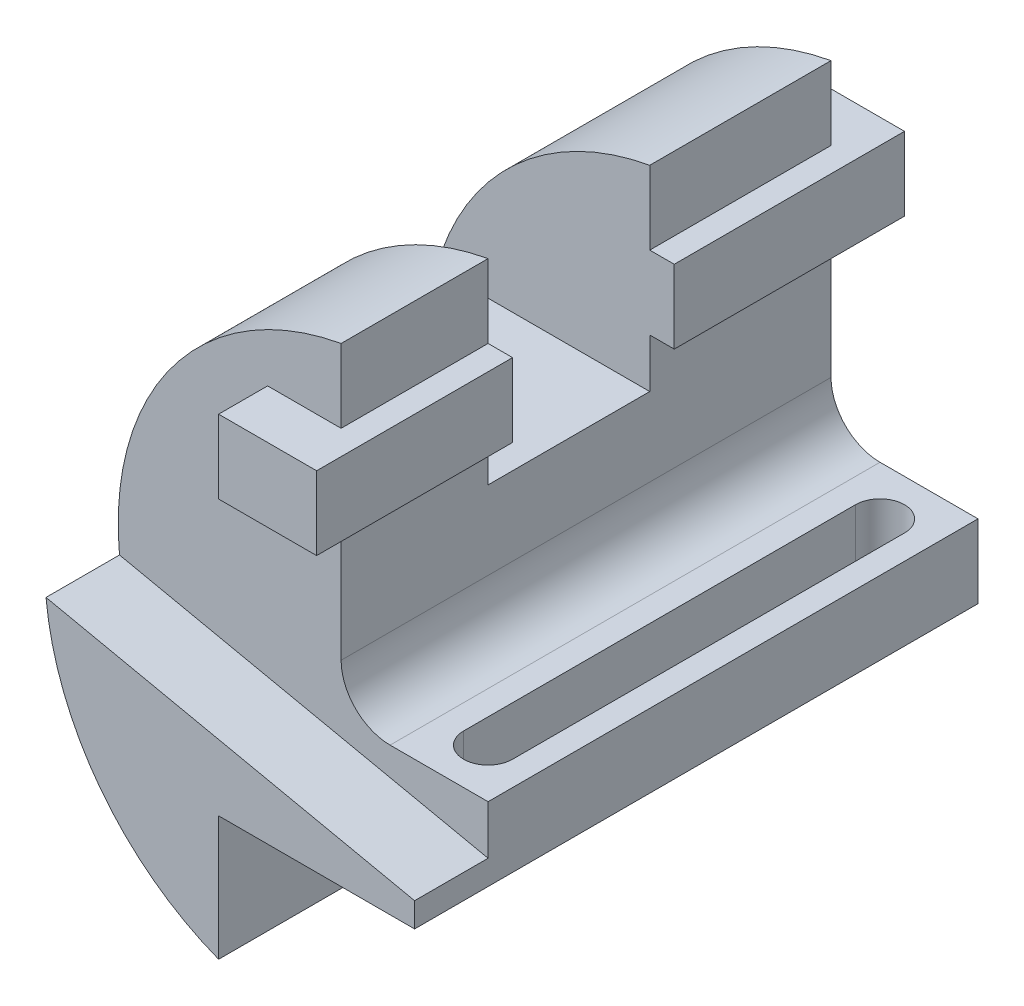
ISO-10303-21;
HEADER;
FILE_DESCRIPTION(('STEP AP214'),'2;1');
FILE_NAME('part.step','',(''),(''),'','','');
FILE_SCHEMA(('AUTOMOTIVE_DESIGN { 1 0 10303 214 1 1 1 1 }'));
ENDSEC;
DATA;
#1=APPLICATION_CONTEXT('core data for automotive mechanical design processes');
#2=APPLICATION_PROTOCOL_DEFINITION('international standard','automotive_design',2000,#1);
#3=PRODUCT_CONTEXT('',#1,'mechanical');
#4=PRODUCT('Part','Part','',(#3));
#5=PRODUCT_RELATED_PRODUCT_CATEGORY('part','',(#4));
#6=PRODUCT_DEFINITION_FORMATION('','',#4);
#7=PRODUCT_DEFINITION_CONTEXT('part definition',#1,'design');
#8=PRODUCT_DEFINITION('design','',#6,#7);
#9=PRODUCT_DEFINITION_SHAPE('','',#8);
#10=(LENGTH_UNIT() NAMED_UNIT(*) SI_UNIT(.MILLI.,.METRE.));
#11=(NAMED_UNIT(*) PLANE_ANGLE_UNIT() SI_UNIT($,.RADIAN.));
#12=(NAMED_UNIT(*) SI_UNIT($,.STERADIAN.) SOLID_ANGLE_UNIT());
#13=UNCERTAINTY_MEASURE_WITH_UNIT(LENGTH_MEASURE(1.E-05),#10,'distance_accuracy_value','');
#14=(GEOMETRIC_REPRESENTATION_CONTEXT(3) GLOBAL_UNCERTAINTY_ASSIGNED_CONTEXT((#13)) GLOBAL_UNIT_ASSIGNED_CONTEXT((#10,
#11,#12)) REPRESENTATION_CONTEXT('',''));
#15=CARTESIAN_POINT('',(0.,0.,0.));
#16=DIRECTION('',(0.,0.,1.));
#17=DIRECTION('',(1.,0.,0.));
#18=AXIS2_PLACEMENT_3D('',#15,#16,#17);
#19=CARTESIAN_POINT('',(-30.,15.,115.));
#20=DIRECTION('',(-1.,0.,0.));
#21=DIRECTION('',(0.,0.,1.));
#22=AXIS2_PLACEMENT_3D('',#19,#20,#21);
#23=PLANE('',#22);
#24=DIRECTION('',(0.,0.,1.));
#25=VECTOR('',#24,1.);
#26=CARTESIAN_POINT('',(-30.,66.,115.));
#27=LINE('',#26,#25);
#28=CARTESIAN_POINT('',(-30.,66.,70.));
#29=VERTEX_POINT('',#28);
#30=CARTESIAN_POINT('',(-30.,66.,100.));
#31=VERTEX_POINT('',#30);
#32=EDGE_CURVE('E372',#29,#31,#27,.T.);
#33=ORIENTED_EDGE('',*,*,#32,.F.);
#34=DIRECTION('',(0.,1.,0.));
#35=VECTOR('',#34,1.);
#36=CARTESIAN_POINT('',(-30.,15.,70.));
#37=LINE('',#36,#35);
#38=CARTESIAN_POINT('',(-30.,81.,70.));
#39=VERTEX_POINT('',#38);
#40=EDGE_CURVE('E303',#29,#39,#37,.T.);
#41=ORIENTED_EDGE('',*,*,#40,.T.);
#42=DIRECTION('',(0.,0.,-1.));
#43=VECTOR('',#42,1.);
#44=CARTESIAN_POINT('',(-30.,81.,115.));
#45=LINE('',#44,#43);
#46=CARTESIAN_POINT('',(-30.,81.,100.));
#47=VERTEX_POINT('',#46);
#48=EDGE_CURVE('E465',#47,#39,#45,.T.);
#49=ORIENTED_EDGE('',*,*,#48,.F.);
#50=DIRECTION('',(0.,1.,0.));
#51=VECTOR('',#50,1.);
#52=CARTESIAN_POINT('',(-30.,15.,100.));
#53=LINE('',#52,#51);
#54=EDGE_CURVE('E401',#31,#47,#53,.T.);
#55=ORIENTED_EDGE('',*,*,#54,.F.);
#56=EDGE_LOOP('',(#33,#41,#49,#55));
#57=FACE_BOUND('',#56,.T.);
#58=ADVANCED_FACE('F49',(#57),#23,.F.);
#59=CARTESIAN_POINT('',(-25.,66.,-10.));
#60=DIRECTION('',(-1.,0.,0.));
#61=DIRECTION('',(0.,-1.,0.));
#62=AXIS2_PLACEMENT_3D('',#59,#60,#61);
#63=PLANE('',#62);
#64=DIRECTION('',(0.,0.,1.));
#65=VECTOR('',#64,1.);
#66=CARTESIAN_POINT('',(-25.,51.,-10.));
#67=LINE('',#66,#65);
#68=CARTESIAN_POINT('',(-25.,51.,70.));
#69=VERTEX_POINT('',#68);
#70=CARTESIAN_POINT('',(-25.,51.,110.));
#71=VERTEX_POINT('',#70);
#72=EDGE_CURVE('E367',#69,#71,#67,.T.);
#73=ORIENTED_EDGE('',*,*,#72,.F.);
#74=DIRECTION('',(0.,1.,0.));
#75=VECTOR('',#74,1.);
#76=CARTESIAN_POINT('',(-25.,66.,70.));
#77=LINE('',#76,#75);
#78=CARTESIAN_POINT('',(-25.,66.,70.));
#79=VERTEX_POINT('',#78);
#80=EDGE_CURVE('E299',#69,#79,#77,.T.);
#81=ORIENTED_EDGE('',*,*,#80,.T.);
#82=DIRECTION('',(0.,0.,1.));
#83=VECTOR('',#82,1.);
#84=CARTESIAN_POINT('',(-25.,66.,-10.));
#85=LINE('',#84,#83);
#86=CARTESIAN_POINT('',(-25.,66.,110.));
#87=VERTEX_POINT('',#86);
#88=EDGE_CURVE('E352',#79,#87,#85,.T.);
#89=ORIENTED_EDGE('',*,*,#88,.T.);
#90=DIRECTION('',(0.,1.,0.));
#91=VECTOR('',#90,1.);
#92=CARTESIAN_POINT('',(-25.,66.,110.));
#93=LINE('',#92,#91);
#94=EDGE_CURVE('E331',#71,#87,#93,.T.);
#95=ORIENTED_EDGE('',*,*,#94,.F.);
#96=EDGE_LOOP('',(#73,#81,#89,#95));
#97=FACE_BOUND('',#96,.T.);
#98=ADVANCED_FACE('F534',(#97),#63,.F.);
#99=CARTESIAN_POINT('',(-25.,51.,-10.));
#100=DIRECTION('',(0.,1.,0.));
#101=DIRECTION('',(0.,0.,1.));
#102=AXIS2_PLACEMENT_3D('',#99,#100,#101);
#103=PLANE('',#102);
#104=DIRECTION('',(0.,0.,-1.));
#105=VECTOR('',#104,1.);
#106=CARTESIAN_POINT('',(-30.,51.,115.));
#107=LINE('',#106,#105);
#108=CARTESIAN_POINT('',(-30.,51.,100.));
#109=VERTEX_POINT('',#108);
#110=CARTESIAN_POINT('',(-30.,51.,70.));
#111=VERTEX_POINT('',#110);
#112=EDGE_CURVE('E386',#109,#111,#107,.T.);
#113=ORIENTED_EDGE('',*,*,#112,.T.);
#114=DIRECTION('',(1.,0.,0.));
#115=VECTOR('',#114,1.);
#116=CARTESIAN_POINT('',(-25.,51.,70.));
#117=LINE('',#116,#115);
#118=EDGE_CURVE('E307',#111,#69,#117,.T.);
#119=ORIENTED_EDGE('',*,*,#118,.T.);
#120=ORIENTED_EDGE('',*,*,#72,.T.);
#121=DIRECTION('',(1.,0.,0.));
#122=VECTOR('',#121,1.);
#123=CARTESIAN_POINT('',(-25.,51.,110.));
#124=LINE('',#123,#122);
#125=CARTESIAN_POINT('',(-45.,51.,110.));
#126=VERTEX_POINT('',#125);
#127=EDGE_CURVE('E335',#126,#71,#124,.T.);
#128=ORIENTED_EDGE('',*,*,#127,.F.);
#129=DIRECTION('',(0.,0.,1.));
#130=VECTOR('',#129,1.);
#131=CARTESIAN_POINT('',(-45.,51.,-10.));
#132=LINE('',#131,#130);
#133=CARTESIAN_POINT('',(-45.,51.,100.));
#134=VERTEX_POINT('',#133);
#135=EDGE_CURVE('E362',#134,#126,#132,.T.);
#136=ORIENTED_EDGE('',*,*,#135,.F.);
#137=DIRECTION('',(-1.,0.,0.));
#138=VECTOR('',#137,1.);
#139=CARTESIAN_POINT('',(-20.,51.,100.));
#140=LINE('',#139,#138);
#141=EDGE_CURVE('E484',#109,#134,#140,.T.);
#142=ORIENTED_EDGE('',*,*,#141,.F.);
#143=EDGE_LOOP('',(#113,#119,#120,#128,#136,#142));
#144=FACE_BOUND('',#143,.T.);
#145=ADVANCED_FACE('F553',(#144),#103,.F.);
#146=CARTESIAN_POINT('',(-25.,66.,-10.));
#147=DIRECTION('',(0.,-1.,0.));
#148=DIRECTION('',(0.,0.,-1.));
#149=AXIS2_PLACEMENT_3D('',#146,#147,#148);
#150=PLANE('',#149);
#151=ORIENTED_EDGE('',*,*,#88,.F.);
#152=DIRECTION('',(-1.,0.,0.));
#153=VECTOR('',#152,1.);
#154=CARTESIAN_POINT('',(-25.,66.,70.));
#155=LINE('',#154,#153);
#156=EDGE_CURVE('E492',#79,#29,#155,.T.);
#157=ORIENTED_EDGE('',*,*,#156,.T.);
#158=ORIENTED_EDGE('',*,*,#32,.T.);
#159=DIRECTION('',(1.,0.,0.));
#160=VECTOR('',#159,1.);
#161=CARTESIAN_POINT('',(-20.,66.,100.));
#162=LINE('',#161,#160);
#163=CARTESIAN_POINT('',(-45.,66.,100.));
#164=VERTEX_POINT('',#163);
#165=EDGE_CURVE('E476',#164,#31,#162,.T.);
#166=ORIENTED_EDGE('',*,*,#165,.F.);
#167=DIRECTION('',(0.,0.,1.));
#168=VECTOR('',#167,1.);
#169=CARTESIAN_POINT('',(-45.,66.,-10.));
#170=LINE('',#169,#168);
#171=CARTESIAN_POINT('',(-45.,66.,110.));
#172=VERTEX_POINT('',#171);
#173=EDGE_CURVE('E357',#164,#172,#170,.T.);
#174=ORIENTED_EDGE('',*,*,#173,.T.);
#175=DIRECTION('',(-1.,0.,0.));
#176=VECTOR('',#175,1.);
#177=CARTESIAN_POINT('',(-25.,66.,110.));
#178=LINE('',#177,#176);
#179=EDGE_CURVE('E327',#87,#172,#178,.T.);
#180=ORIENTED_EDGE('',*,*,#179,.F.);
#181=EDGE_LOOP('',(#151,#157,#158,#166,#174,#180));
#182=FACE_BOUND('',#181,.T.);
#183=ADVANCED_FACE('F541',(#182),#150,.F.);
#184=CARTESIAN_POINT('',(-30.,25.,100.));
#185=VERTEX_POINT('',#184);
#186=EDGE_CURVE('E402',#185,#109,#53,.T.);
#187=ORIENTED_EDGE('',*,*,#186,.F.);
#188=DIRECTION('',(0.,0.,-1.));
#189=VECTOR('',#188,1.);
#190=CARTESIAN_POINT('',(-30.,25.,0.));
#191=LINE('',#190,#189);
#192=CARTESIAN_POINT('',(-30.,25.,0.));
#193=VERTEX_POINT('',#192);
#194=EDGE_CURVE('E513',#185,#193,#191,.T.);
#195=ORIENTED_EDGE('',*,*,#194,.T.);
#196=DIRECTION('',(0.,1.,0.));
#197=VECTOR('',#196,1.);
#198=CARTESIAN_POINT('',(-30.,15.,0.));
#199=LINE('',#198,#197);
#200=CARTESIAN_POINT('',(-30.,51.,0.));
#201=VERTEX_POINT('',#200);
#202=EDGE_CURVE('E449',#193,#201,#199,.T.);
#203=ORIENTED_EDGE('',*,*,#202,.T.);
#204=CARTESIAN_POINT('',(-30.,51.,37.));
#205=VERTEX_POINT('',#204);
#206=EDGE_CURVE('E385',#205,#201,#107,.T.);
#207=ORIENTED_EDGE('',*,*,#206,.F.);
#208=DIRECTION('',(0.,-1.,0.));
#209=VECTOR('',#208,1.);
#210=CARTESIAN_POINT('',(-30.,15.,37.));
#211=LINE('',#210,#209);
#212=CARTESIAN_POINT('',(-30.,41.,37.));
#213=VERTEX_POINT('',#212);
#214=EDGE_CURVE('E295',#205,#213,#211,.T.);
#215=ORIENTED_EDGE('',*,*,#214,.T.);
#216=DIRECTION('',(0.,0.,1.));
#217=VECTOR('',#216,1.);
#218=CARTESIAN_POINT('',(-30.,41.,115.));
#219=LINE('',#218,#217);
#220=CARTESIAN_POINT('',(-30.,41.,70.));
#221=VERTEX_POINT('',#220);
#222=EDGE_CURVE('E319',#213,#221,#219,.T.);
#223=ORIENTED_EDGE('',*,*,#222,.T.);
#224=DIRECTION('',(0.,1.,0.));
#225=VECTOR('',#224,1.);
#226=CARTESIAN_POINT('',(-30.,15.,70.));
#227=LINE('',#226,#225);
#228=EDGE_CURVE('E315',#221,#111,#227,.T.);
#229=ORIENTED_EDGE('',*,*,#228,.T.);
#230=ORIENTED_EDGE('',*,*,#112,.F.);
#231=EDGE_LOOP('',(#187,#195,#203,#207,#215,#223,#229,#230));
#232=FACE_BOUND('',#231,.T.);
#233=ADVANCED_FACE('F555',(#232),#23,.F.);
#234=CARTESIAN_POINT('',(-30.,81.,37.));
#235=VERTEX_POINT('',#234);
#236=CARTESIAN_POINT('',(-30.,81.,0.));
#237=VERTEX_POINT('',#236);
#238=EDGE_CURVE('E464',#235,#237,#45,.T.);
#239=ORIENTED_EDGE('',*,*,#238,.F.);
#240=DIRECTION('',(0.,-1.,0.));
#241=VECTOR('',#240,1.);
#242=CARTESIAN_POINT('',(-30.,15.,37.));
#243=LINE('',#242,#241);
#244=CARTESIAN_POINT('',(-30.,66.,37.));
#245=VERTEX_POINT('',#244);
#246=EDGE_CURVE('E283',#235,#245,#243,.T.);
#247=ORIENTED_EDGE('',*,*,#246,.T.);
#248=CARTESIAN_POINT('',(-30.,66.,0.));
#249=VERTEX_POINT('',#248);
#250=EDGE_CURVE('E373',#249,#245,#27,.T.);
#251=ORIENTED_EDGE('',*,*,#250,.F.);
#252=EDGE_CURVE('E448',#249,#237,#199,.T.);
#253=ORIENTED_EDGE('',*,*,#252,.T.);
#254=EDGE_LOOP('',(#239,#247,#251,#253));
#255=FACE_BOUND('',#254,.T.);
#256=ADVANCED_FACE('F612',(#255),#23,.F.);
#257=CARTESIAN_POINT('',(-20.,26.4083339693685,0.));
#258=DIRECTION('',(0.,0.,-1.));
#259=DIRECTION('',(-1.,0.,0.));
#260=AXIS2_PLACEMENT_3D('',#257,#258,#259);
#261=PLANE('',#260);
#262=DIRECTION('',(0.,-1.,0.));
#263=VECTOR('',#262,1.);
#264=CARTESIAN_POINT('',(-45.,26.4083339693685,0.));
#265=LINE('',#264,#263);
#266=CARTESIAN_POINT('',(-45.,66.,0.));
#267=VERTEX_POINT('',#266);
#268=CARTESIAN_POINT('',(-45.,51.,0.));
#269=VERTEX_POINT('',#268);
#270=EDGE_CURVE('E381',#267,#269,#265,.T.);
#271=ORIENTED_EDGE('',*,*,#270,.T.);
#272=DIRECTION('',(1.,0.,0.));
#273=VECTOR('',#272,1.);
#274=CARTESIAN_POINT('',(-20.,51.,0.));
#275=LINE('',#274,#273);
#276=EDGE_CURVE('E390',#269,#201,#275,.T.);
#277=ORIENTED_EDGE('',*,*,#276,.T.);
#278=ORIENTED_EDGE('',*,*,#202,.F.);
#279=CARTESIAN_POINT('',(-20.,25.,0.));
#280=DIRECTION('',(0.,0.,-1.));
#281=DIRECTION('',(-1.,0.,0.));
#282=AXIS2_PLACEMENT_3D('',#279,#280,#281);
#283=CIRCLE('',#282,10.);
#284=CARTESIAN_POINT('',(-20.,15.,0.));
#285=VERTEX_POINT('',#284);
#286=EDGE_CURVE('E58',#193,#285,#283,.F.);
#287=ORIENTED_EDGE('',*,*,#286,.T.);
#288=DIRECTION('',(-1.,0.,0.));
#289=VECTOR('',#288,1.);
#290=CARTESIAN_POINT('',(0.,15.,0.));
#291=LINE('',#290,#289);
#292=CARTESIAN_POINT('',(0.,15.,0.));
#293=VERTEX_POINT('',#292);
#294=EDGE_CURVE('E445',#293,#285,#291,.T.);
#295=ORIENTED_EDGE('',*,*,#294,.F.);
#296=DIRECTION('',(0.,1.,0.));
#297=VECTOR('',#296,1.);
#298=CARTESIAN_POINT('',(0.,0.,0.));
#299=LINE('',#298,#297);
#300=CARTESIAN_POINT('',(0.,0.,0.));
#301=VERTEX_POINT('',#300);
#302=EDGE_CURVE('E441',#301,#293,#299,.T.);
#303=ORIENTED_EDGE('',*,*,#302,.F.);
#304=DIRECTION('',(1.,0.,0.));
#305=VECTOR('',#304,1.);
#306=CARTESIAN_POINT('',(0.,0.,0.));
#307=LINE('',#306,#305);
#308=CARTESIAN_POINT('',(-40.,0.,0.));
#309=VERTEX_POINT('',#308);
#310=EDGE_CURVE('E419',#309,#301,#307,.T.);
#311=ORIENTED_EDGE('',*,*,#310,.F.);
#312=DIRECTION('',(0.,1.,0.));
#313=VECTOR('',#312,1.);
#314=CARTESIAN_POINT('',(-40.,0.,0.));
#315=LINE('',#314,#313);
#316=CARTESIAN_POINT('',(-40.,-25.3627969821569,0.));
#317=VERTEX_POINT('',#316);
#318=EDGE_CURVE('E427',#317,#309,#315,.T.);
#319=ORIENTED_EDGE('',*,*,#318,.F.);
#320=CARTESIAN_POINT('',(-20.,26.4083339693685,0.));
#321=DIRECTION('',(0.,0.,1.));
#322=DIRECTION('',(-1.,0.,0.));
#323=AXIS2_PLACEMENT_3D('',#320,#321,#322);
#324=CIRCLE('',#323,55.5);
#325=EDGE_CURVE('E452',#237,#317,#324,.T.);
#326=ORIENTED_EDGE('',*,*,#325,.F.);
#327=ORIENTED_EDGE('',*,*,#252,.F.);
#328=DIRECTION('',(-1.,0.,0.));
#329=VECTOR('',#328,1.);
#330=CARTESIAN_POINT('',(-20.,66.,0.));
#331=LINE('',#330,#329);
#332=EDGE_CURVE('E377',#249,#267,#331,.T.);
#333=ORIENTED_EDGE('',*,*,#332,.T.);
#334=EDGE_LOOP('',(#271,#277,#278,#287,#295,#303,#311,#319,#326,#327,#333));
#335=FACE_BOUND('',#334,.T.);
#336=ADVANCED_FACE('F587',(#335),#261,.T.);
#337=CARTESIAN_POINT('',(-20.,26.4083339693685,100.));
#338=DIRECTION('',(0.,0.,1.));
#339=DIRECTION('',(1.,0.,0.));
#340=AXIS2_PLACEMENT_3D('',#337,#338,#339);
#341=PLANE('',#340);
#342=DIRECTION('',(-1.,0.,0.));
#343=VECTOR('',#342,1.);
#344=CARTESIAN_POINT('',(0.,15.,100.));
#345=LINE('',#344,#343);
#346=CARTESIAN_POINT('',(0.,15.,100.));
#347=VERTEX_POINT('',#346);
#348=CARTESIAN_POINT('',(-20.,15.,100.));
#349=VERTEX_POINT('',#348);
#350=EDGE_CURVE('E398',#347,#349,#345,.T.);
#351=ORIENTED_EDGE('',*,*,#350,.T.);
#352=CARTESIAN_POINT('',(-20.,25.,100.));
#353=DIRECTION('',(0.,0.,1.));
#354=DIRECTION('',(1.,0.,0.));
#355=AXIS2_PLACEMENT_3D('',#352,#353,#354);
#356=CIRCLE('',#355,10.);
#357=EDGE_CURVE('E12',#349,#185,#356,.F.);
#358=ORIENTED_EDGE('',*,*,#357,.T.);
#359=ORIENTED_EDGE('',*,*,#186,.T.);
#360=ORIENTED_EDGE('',*,*,#141,.T.);
#361=DIRECTION('',(0.,1.,0.));
#362=VECTOR('',#361,1.);
#363=CARTESIAN_POINT('',(-45.,26.4083339693685,100.));
#364=LINE('',#363,#362);
#365=EDGE_CURVE('E480',#134,#164,#364,.T.);
#366=ORIENTED_EDGE('',*,*,#365,.T.);
#367=ORIENTED_EDGE('',*,*,#165,.T.);
#368=ORIENTED_EDGE('',*,*,#54,.T.);
#369=CARTESIAN_POINT('',(-20.,26.4083339693685,100.));
#370=DIRECTION('',(0.,0.,1.));
#371=DIRECTION('',(1.,0.,0.));
#372=AXIS2_PLACEMENT_3D('',#369,#370,#371);
#373=CIRCLE('',#372,55.5);
#374=CARTESIAN_POINT('',(-75.2350441418964,20.9917022998936,100.));
#375=VERTEX_POINT('',#374);
#376=EDGE_CURVE('E405',#47,#375,#373,.T.);
#377=ORIENTED_EDGE('',*,*,#376,.T.);
#378=DIRECTION('',(0.978147600733806,-0.207911690817756,0.));
#379=VECTOR('',#378,1.);
#380=CARTESIAN_POINT('',(0.,5.,100.));
#381=LINE('',#380,#379);
#382=CARTESIAN_POINT('',(0.,5.,100.));
#383=VERTEX_POINT('',#382);
#384=EDGE_CURVE('E408',#375,#383,#381,.T.);
#385=ORIENTED_EDGE('',*,*,#384,.T.);
#386=DIRECTION('',(0.,1.,0.));
#387=VECTOR('',#386,1.);
#388=CARTESIAN_POINT('',(0.,5.,100.));
#389=LINE('',#388,#387);
#390=EDGE_CURVE('E395',#383,#347,#389,.T.);
#391=ORIENTED_EDGE('',*,*,#390,.T.);
#392=EDGE_LOOP('',(#351,#358,#359,#360,#366,#367,#368,#377,#385,#391));
#393=FACE_BOUND('',#392,.T.);
#394=ADVANCED_FACE('F547',(#393),#341,.T.);
#395=CARTESIAN_POINT('',(0.,15.,115.));
#396=DIRECTION('',(0.,-1.,0.));
#397=DIRECTION('',(1.,0.,0.));
#398=AXIS2_PLACEMENT_3D('',#395,#396,#397);
#399=PLANE('',#398);
#400=DIRECTION('',(0.,0.,-1.));
#401=VECTOR('',#400,1.);
#402=CARTESIAN_POINT('',(-15.,15.,115.));
#403=LINE('',#402,#401);
#404=CARTESIAN_POINT('',(-15.,15.,90.));
#405=VERTEX_POINT('',#404);
#406=CARTESIAN_POINT('',(-15.,15.,9.99999999999999));
#407=VERTEX_POINT('',#406);
#408=EDGE_CURVE('E234',#405,#407,#403,.T.);
#409=ORIENTED_EDGE('',*,*,#408,.T.);
#410=CARTESIAN_POINT('',(-9.99999999999999,15.,10.));
#411=DIRECTION('',(0.,-1.,0.));
#412=DIRECTION('',(1.,0.,0.));
#413=AXIS2_PLACEMENT_3D('',#410,#411,#412);
#414=CIRCLE('',#413,5.);
#415=CARTESIAN_POINT('',(-4.99999999999999,15.,10.));
#416=VERTEX_POINT('',#415);
#417=EDGE_CURVE('E265',#407,#416,#414,.T.);
#418=ORIENTED_EDGE('',*,*,#417,.T.);
#419=DIRECTION('',(0.,0.,1.));
#420=VECTOR('',#419,1.);
#421=CARTESIAN_POINT('',(-5.00000000000001,15.,115.));
#422=LINE('',#421,#420);
#423=CARTESIAN_POINT('',(-5.,15.,90.));
#424=VERTEX_POINT('',#423);
#425=EDGE_CURVE('E261',#416,#424,#422,.T.);
#426=ORIENTED_EDGE('',*,*,#425,.T.);
#427=CARTESIAN_POINT('',(-10.,15.,90.));
#428=DIRECTION('',(0.,-1.,0.));
#429=DIRECTION('',(1.,0.,0.));
#430=AXIS2_PLACEMENT_3D('',#427,#428,#429);
#431=CIRCLE('',#430,5.);
#432=EDGE_CURVE('E246',#424,#405,#431,.T.);
#433=ORIENTED_EDGE('',*,*,#432,.T.);
#434=EDGE_LOOP('',(#409,#418,#426,#433));
#435=FACE_BOUND('',#434,.T.);
#436=ORIENTED_EDGE('',*,*,#294,.T.);
#437=DIRECTION('',(0.,0.,-1.));
#438=VECTOR('',#437,1.);
#439=CARTESIAN_POINT('',(-20.,15.,100.));
#440=LINE('',#439,#438);
#441=EDGE_CURVE('E71',#285,#349,#440,.F.);
#442=ORIENTED_EDGE('',*,*,#441,.T.);
#443=ORIENTED_EDGE('',*,*,#350,.F.);
#444=DIRECTION('',(0.,0.,-1.));
#445=VECTOR('',#444,1.);
#446=CARTESIAN_POINT('',(0.,15.,115.));
#447=LINE('',#446,#445);
#448=EDGE_CURVE('E469',#347,#293,#447,.T.);
#449=ORIENTED_EDGE('',*,*,#448,.T.);
#450=EDGE_LOOP('',(#436,#442,#443,#449));
#451=FACE_BOUND('',#450,.T.);
#452=ADVANCED_FACE('F260',(#435,#451),#399,.F.);
#453=CARTESIAN_POINT('',(0.,0.,115.));
#454=DIRECTION('',(0.,1.,0.));
#455=DIRECTION('',(0.,0.,1.));
#456=AXIS2_PLACEMENT_3D('',#453,#454,#455);
#457=PLANE('',#456);
#458=DIRECTION('',(0.,0.,-1.));
#459=VECTOR('',#458,1.);
#460=CARTESIAN_POINT('',(-5.00000000000001,0.,115.));
#461=LINE('',#460,#459);
#462=CARTESIAN_POINT('',(-5.,0.,90.));
#463=VERTEX_POINT('',#462);
#464=CARTESIAN_POINT('',(-4.99999999999999,0.,10.));
#465=VERTEX_POINT('',#464);
#466=EDGE_CURVE('E505',#463,#465,#461,.T.);
#467=ORIENTED_EDGE('',*,*,#466,.T.);
#468=CARTESIAN_POINT('',(-9.99999999999999,0.,10.));
#469=DIRECTION('',(0.,1.,0.));
#470=DIRECTION('',(0.,0.,1.));
#471=AXIS2_PLACEMENT_3D('',#468,#469,#470);
#472=CIRCLE('',#471,5.);
#473=CARTESIAN_POINT('',(-15.,0.,10.));
#474=VERTEX_POINT('',#473);
#475=EDGE_CURVE('E509',#465,#474,#472,.T.);
#476=ORIENTED_EDGE('',*,*,#475,.T.);
#477=DIRECTION('',(0.,0.,1.));
#478=VECTOR('',#477,1.);
#479=CARTESIAN_POINT('',(-15.,0.,115.));
#480=LINE('',#479,#478);
#481=CARTESIAN_POINT('',(-15.,0.,90.));
#482=VERTEX_POINT('',#481);
#483=EDGE_CURVE('E500',#474,#482,#480,.T.);
#484=ORIENTED_EDGE('',*,*,#483,.T.);
#485=CARTESIAN_POINT('',(-10.,0.,90.));
#486=DIRECTION('',(0.,1.,0.));
#487=DIRECTION('',(0.,0.,1.));
#488=AXIS2_PLACEMENT_3D('',#485,#486,#487);
#489=CIRCLE('',#488,5.);
#490=EDGE_CURVE('E254',#482,#463,#489,.T.);
#491=ORIENTED_EDGE('',*,*,#490,.T.);
#492=EDGE_LOOP('',(#467,#476,#484,#491));
#493=FACE_BOUND('',#492,.T.);
#494=ORIENTED_EDGE('',*,*,#310,.T.);
#495=DIRECTION('',(0.,0.,-1.));
#496=VECTOR('',#495,1.);
#497=CARTESIAN_POINT('',(0.,0.,115.));
#498=LINE('',#497,#496);
#499=CARTESIAN_POINT('',(0.,0.,115.));
#500=VERTEX_POINT('',#499);
#501=EDGE_CURVE('E472',#500,#301,#498,.T.);
#502=ORIENTED_EDGE('',*,*,#501,.F.);
#503=DIRECTION('',(1.,0.,0.));
#504=VECTOR('',#503,1.);
#505=CARTESIAN_POINT('',(0.,0.,115.));
#506=LINE('',#505,#504);
#507=CARTESIAN_POINT('',(-40.,0.,115.));
#508=VERTEX_POINT('',#507);
#509=EDGE_CURVE('E422',#508,#500,#506,.T.);
#510=ORIENTED_EDGE('',*,*,#509,.F.);
#511=DIRECTION('',(0.,0.,-1.));
#512=VECTOR('',#511,1.);
#513=CARTESIAN_POINT('',(-40.,0.,115.));
#514=LINE('',#513,#512);
#515=EDGE_CURVE('E437',#508,#309,#514,.T.);
#516=ORIENTED_EDGE('',*,*,#515,.T.);
#517=EDGE_LOOP('',(#494,#502,#510,#516));
#518=FACE_BOUND('',#517,.T.);
#519=ADVANCED_FACE('F620',(#493,#518),#457,.F.);
#520=CARTESIAN_POINT('',(0.,0.,115.));
#521=DIRECTION('',(-1.,0.,0.));
#522=DIRECTION('',(0.,0.,1.));
#523=AXIS2_PLACEMENT_3D('',#520,#521,#522);
#524=PLANE('',#523);
#525=ORIENTED_EDGE('',*,*,#390,.F.);
#526=DIRECTION('',(0.,0.,1.));
#527=VECTOR('',#526,1.);
#528=CARTESIAN_POINT('',(0.,5.,100.));
#529=LINE('',#528,#527);
#530=CARTESIAN_POINT('',(0.,5.,115.));
#531=VERTEX_POINT('',#530);
#532=EDGE_CURVE('E415',#383,#531,#529,.T.);
#533=ORIENTED_EDGE('',*,*,#532,.T.);
#534=DIRECTION('',(0.,1.,0.));
#535=VECTOR('',#534,1.);
#536=CARTESIAN_POINT('',(0.,0.,115.));
#537=LINE('',#536,#535);
#538=EDGE_CURVE('E426',#500,#531,#537,.T.);
#539=ORIENTED_EDGE('',*,*,#538,.F.);
#540=ORIENTED_EDGE('',*,*,#501,.T.);
#541=ORIENTED_EDGE('',*,*,#302,.T.);
#542=ORIENTED_EDGE('',*,*,#448,.F.);
#543=EDGE_LOOP('',(#525,#533,#539,#540,#541,#542));
#544=FACE_BOUND('',#543,.T.);
#545=ADVANCED_FACE('F583',(#544),#524,.F.);
#546=CARTESIAN_POINT('',(-20.,26.4083339693685,115.));
#547=DIRECTION('',(0.,0.,-1.));
#548=DIRECTION('',(-1.,0.,0.));
#549=AXIS2_PLACEMENT_3D('',#546,#547,#548);
#550=CYLINDRICAL_SURFACE('',#549,55.5);
#551=ORIENTED_EDGE('',*,*,#48,.T.);
#552=CARTESIAN_POINT('',(-20.,26.4083339693685,70.));
#553=DIRECTION('',(0.,0.,1.));
#554=DIRECTION('',(1.,0.,0.));
#555=AXIS2_PLACEMENT_3D('',#552,#553,#554);
#556=CIRCLE('',#555,55.5);
#557=CARTESIAN_POINT('',(-73.5474862383895,41.,70.));
#558=VERTEX_POINT('',#557);
#559=EDGE_CURVE('E311',#39,#558,#556,.T.);
#560=ORIENTED_EDGE('',*,*,#559,.T.);
#561=DIRECTION('',(0.,0.,-1.));
#562=VECTOR('',#561,1.);
#563=CARTESIAN_POINT('',(-73.5474862383895,41.,115.));
#564=LINE('',#563,#562);
#565=CARTESIAN_POINT('',(-73.5474862383895,41.,37.));
#566=VERTEX_POINT('',#565);
#567=EDGE_CURVE('E496',#558,#566,#564,.T.);
#568=ORIENTED_EDGE('',*,*,#567,.T.);
#569=CARTESIAN_POINT('',(-20.,26.4083339693685,37.));
#570=DIRECTION('',(0.,0.,-1.));
#571=DIRECTION('',(-1.,0.,0.));
#572=AXIS2_PLACEMENT_3D('',#569,#570,#571);
#573=CIRCLE('',#572,55.5);
#574=EDGE_CURVE('E291',#566,#235,#573,.T.);
#575=ORIENTED_EDGE('',*,*,#574,.T.);
#576=ORIENTED_EDGE('',*,*,#238,.T.);
#577=ORIENTED_EDGE('',*,*,#325,.T.);
#578=DIRECTION('',(0.,0.,-1.));
#579=VECTOR('',#578,1.);
#580=CARTESIAN_POINT('',(-40.,-25.3627969821569,115.));
#581=LINE('',#580,#579);
#582=CARTESIAN_POINT('',(-40.,-25.3627969821569,115.));
#583=VERTEX_POINT('',#582);
#584=EDGE_CURVE('E460',#583,#317,#581,.T.);
#585=ORIENTED_EDGE('',*,*,#584,.F.);
#586=CARTESIAN_POINT('',(-20.,26.4083339693685,115.));
#587=DIRECTION('',(0.,0.,1.));
#588=DIRECTION('',(-1.,0.,0.));
#589=AXIS2_PLACEMENT_3D('',#586,#587,#588);
#590=CIRCLE('',#589,55.5);
#591=CARTESIAN_POINT('',(-75.2350441418964,20.9917022998936,115.));
#592=VERTEX_POINT('',#591);
#593=EDGE_CURVE('E431',#592,#583,#590,.T.);
#594=ORIENTED_EDGE('',*,*,#593,.F.);
#595=DIRECTION('',(0.,0.,1.));
#596=VECTOR('',#595,1.);
#597=CARTESIAN_POINT('',(-75.2350441418964,20.9917022998936,100.));
#598=LINE('',#597,#596);
#599=EDGE_CURVE('E412',#375,#592,#598,.T.);
#600=ORIENTED_EDGE('',*,*,#599,.F.);
#601=ORIENTED_EDGE('',*,*,#376,.F.);
#602=EDGE_LOOP('',(#551,#560,#568,#575,#576,#577,#585,#594,#600,#601));
#603=FACE_BOUND('',#602,.T.);
#604=ADVANCED_FACE('F564',(#603),#550,.T.);
#605=CARTESIAN_POINT('',(-40.,0.,115.));
#606=DIRECTION('',(-1.,0.,0.));
#607=DIRECTION('',(0.,-1.,0.));
#608=AXIS2_PLACEMENT_3D('',#605,#606,#607);
#609=PLANE('',#608);
#610=ORIENTED_EDGE('',*,*,#318,.T.);
#611=ORIENTED_EDGE('',*,*,#515,.F.);
#612=DIRECTION('',(0.,1.,0.));
#613=VECTOR('',#612,1.);
#614=CARTESIAN_POINT('',(-40.,0.,115.));
#615=LINE('',#614,#613);
#616=EDGE_CURVE('E434',#583,#508,#615,.T.);
#617=ORIENTED_EDGE('',*,*,#616,.F.);
#618=ORIENTED_EDGE('',*,*,#584,.T.);
#619=EDGE_LOOP('',(#610,#611,#617,#618));
#620=FACE_BOUND('',#619,.T.);
#621=ADVANCED_FACE('F617',(#620),#609,.F.);
#622=CARTESIAN_POINT('',(-20.,26.4083339693685,115.));
#623=DIRECTION('',(0.,0.,-1.));
#624=DIRECTION('',(-1.,0.,0.));
#625=AXIS2_PLACEMENT_3D('',#622,#623,#624);
#626=PLANE('',#625);
#627=ORIENTED_EDGE('',*,*,#538,.T.);
#628=DIRECTION('',(0.978147600733806,-0.207911690817756,0.));
#629=VECTOR('',#628,1.);
#630=CARTESIAN_POINT('',(0.,5.,115.));
#631=LINE('',#630,#629);
#632=EDGE_CURVE('E394',#592,#531,#631,.T.);
#633=ORIENTED_EDGE('',*,*,#632,.F.);
#634=ORIENTED_EDGE('',*,*,#593,.T.);
#635=ORIENTED_EDGE('',*,*,#616,.T.);
#636=ORIENTED_EDGE('',*,*,#509,.T.);
#637=EDGE_LOOP('',(#627,#633,#634,#635,#636));
#638=FACE_BOUND('',#637,.T.);
#639=ADVANCED_FACE('F578',(#638),#626,.F.);
#640=CARTESIAN_POINT('',(0.,5.,100.));
#641=DIRECTION('',(-0.207911690817756,-0.978147600733806,0.));
#642=DIRECTION('',(0.978147600733806,-0.207911690817756,0.));
#643=AXIS2_PLACEMENT_3D('',#640,#641,#642);
#644=PLANE('',#643);
#645=ORIENTED_EDGE('',*,*,#632,.T.);
#646=ORIENTED_EDGE('',*,*,#532,.F.);
#647=ORIENTED_EDGE('',*,*,#384,.F.);
#648=ORIENTED_EDGE('',*,*,#599,.T.);
#649=EDGE_LOOP('',(#645,#646,#647,#648));
#650=FACE_BOUND('',#649,.T.);
#651=ADVANCED_FACE('F576',(#650),#644,.F.);
#652=CARTESIAN_POINT('',(-45.,66.,-10.));
#653=DIRECTION('',(1.,0.,0.));
#654=DIRECTION('',(0.,0.,-1.));
#655=AXIS2_PLACEMENT_3D('',#652,#653,#654);
#656=PLANE('',#655);
#657=ORIENTED_EDGE('',*,*,#270,.F.);
#658=CARTESIAN_POINT('',(-45.,66.,-10.));
#659=VERTEX_POINT('',#658);
#660=EDGE_CURVE('E358',#659,#267,#170,.T.);
#661=ORIENTED_EDGE('',*,*,#660,.F.);
#662=DIRECTION('',(0.,1.,0.));
#663=VECTOR('',#662,1.);
#664=CARTESIAN_POINT('',(-45.,66.,-10.));
#665=LINE('',#664,#663);
#666=CARTESIAN_POINT('',(-45.,51.,-10.));
#667=VERTEX_POINT('',#666);
#668=EDGE_CURVE('E346',#667,#659,#665,.T.);
#669=ORIENTED_EDGE('',*,*,#668,.F.);
#670=EDGE_CURVE('E363',#667,#269,#132,.T.);
#671=ORIENTED_EDGE('',*,*,#670,.T.);
#672=EDGE_LOOP('',(#657,#661,#669,#671));
#673=FACE_BOUND('',#672,.T.);
#674=ADVANCED_FACE('F595',(#673),#656,.F.);
#675=CARTESIAN_POINT('',(-25.,66.,-10.));
#676=VERTEX_POINT('',#675);
#677=CARTESIAN_POINT('',(-25.,66.,37.));
#678=VERTEX_POINT('',#677);
#679=EDGE_CURVE('E353',#676,#678,#85,.T.);
#680=ORIENTED_EDGE('',*,*,#679,.T.);
#681=DIRECTION('',(0.,-1.,0.));
#682=VECTOR('',#681,1.);
#683=CARTESIAN_POINT('',(-25.,66.,37.));
#684=LINE('',#683,#682);
#685=CARTESIAN_POINT('',(-25.,51.,37.));
#686=VERTEX_POINT('',#685);
#687=EDGE_CURVE('E276',#678,#686,#684,.T.);
#688=ORIENTED_EDGE('',*,*,#687,.T.);
#689=CARTESIAN_POINT('',(-25.,51.,-10.));
#690=VERTEX_POINT('',#689);
#691=EDGE_CURVE('E368',#690,#686,#67,.T.);
#692=ORIENTED_EDGE('',*,*,#691,.F.);
#693=DIRECTION('',(0.,-1.,0.));
#694=VECTOR('',#693,1.);
#695=CARTESIAN_POINT('',(-25.,66.,-10.));
#696=LINE('',#695,#694);
#697=EDGE_CURVE('E339',#676,#690,#696,.T.);
#698=ORIENTED_EDGE('',*,*,#697,.F.);
#699=EDGE_LOOP('',(#680,#688,#692,#698));
#700=FACE_BOUND('',#699,.T.);
#701=ADVANCED_FACE('F604',(#700),#63,.F.);
#702=ORIENTED_EDGE('',*,*,#691,.T.);
#703=DIRECTION('',(-1.,0.,0.));
#704=VECTOR('',#703,1.);
#705=CARTESIAN_POINT('',(-25.,51.,37.));
#706=LINE('',#705,#704);
#707=EDGE_CURVE('E287',#686,#205,#706,.T.);
#708=ORIENTED_EDGE('',*,*,#707,.T.);
#709=ORIENTED_EDGE('',*,*,#206,.T.);
#710=ORIENTED_EDGE('',*,*,#276,.F.);
#711=ORIENTED_EDGE('',*,*,#670,.F.);
#712=DIRECTION('',(-1.,0.,0.));
#713=VECTOR('',#712,1.);
#714=CARTESIAN_POINT('',(-25.,51.,-10.));
#715=LINE('',#714,#713);
#716=EDGE_CURVE('E343',#690,#667,#715,.T.);
#717=ORIENTED_EDGE('',*,*,#716,.F.);
#718=EDGE_LOOP('',(#702,#708,#709,#710,#711,#717));
#719=FACE_BOUND('',#718,.T.);
#720=ADVANCED_FACE('F592',(#719),#103,.F.);
#721=ORIENTED_EDGE('',*,*,#365,.F.);
#722=ORIENTED_EDGE('',*,*,#135,.T.);
#723=DIRECTION('',(0.,-1.,0.));
#724=VECTOR('',#723,1.);
#725=CARTESIAN_POINT('',(-45.,66.,110.));
#726=LINE('',#725,#724);
#727=EDGE_CURVE('E323',#172,#126,#726,.T.);
#728=ORIENTED_EDGE('',*,*,#727,.F.);
#729=ORIENTED_EDGE('',*,*,#173,.F.);
#730=EDGE_LOOP('',(#721,#722,#728,#729));
#731=FACE_BOUND('',#730,.T.);
#732=ADVANCED_FACE('F544',(#731),#656,.F.);
#733=ORIENTED_EDGE('',*,*,#250,.T.);
#734=DIRECTION('',(1.,0.,0.));
#735=VECTOR('',#734,1.);
#736=CARTESIAN_POINT('',(-25.,66.,37.));
#737=LINE('',#736,#735);
#738=EDGE_CURVE('E488',#245,#678,#737,.T.);
#739=ORIENTED_EDGE('',*,*,#738,.T.);
#740=ORIENTED_EDGE('',*,*,#679,.F.);
#741=DIRECTION('',(1.,0.,0.));
#742=VECTOR('',#741,1.);
#743=CARTESIAN_POINT('',(-25.,66.,-10.));
#744=LINE('',#743,#742);
#745=EDGE_CURVE('E349',#659,#676,#744,.T.);
#746=ORIENTED_EDGE('',*,*,#745,.F.);
#747=ORIENTED_EDGE('',*,*,#660,.T.);
#748=ORIENTED_EDGE('',*,*,#332,.F.);
#749=EDGE_LOOP('',(#733,#739,#740,#746,#747,#748));
#750=FACE_BOUND('',#749,.T.);
#751=ADVANCED_FACE('F608',(#750),#150,.F.);
#752=CARTESIAN_POINT('',(0.,0.,-10.));
#753=DIRECTION('',(0.,0.,-1.));
#754=DIRECTION('',(-1.,0.,0.));
#755=AXIS2_PLACEMENT_3D('',#752,#753,#754);
#756=PLANE('',#755);
#757=ORIENTED_EDGE('',*,*,#697,.T.);
#758=ORIENTED_EDGE('',*,*,#716,.T.);
#759=ORIENTED_EDGE('',*,*,#668,.T.);
#760=ORIENTED_EDGE('',*,*,#745,.T.);
#761=EDGE_LOOP('',(#757,#758,#759,#760));
#762=FACE_BOUND('',#761,.T.);
#763=ADVANCED_FACE('F599',(#762),#756,.T.);
#764=CARTESIAN_POINT('',(-20.,26.4083339693685,110.));
#765=DIRECTION('',(0.,0.,-1.));
#766=DIRECTION('',(-1.,0.,0.));
#767=AXIS2_PLACEMENT_3D('',#764,#765,#766);
#768=PLANE('',#767);
#769=ORIENTED_EDGE('',*,*,#94,.T.);
#770=ORIENTED_EDGE('',*,*,#179,.T.);
#771=ORIENTED_EDGE('',*,*,#727,.T.);
#772=ORIENTED_EDGE('',*,*,#127,.T.);
#773=EDGE_LOOP('',(#769,#770,#771,#772));
#774=FACE_BOUND('',#773,.T.);
#775=ADVANCED_FACE('F538',(#774),#768,.F.);
#776=CARTESIAN_POINT('',(-75.5,41.,70.));
#777=DIRECTION('',(0.,-1.,0.));
#778=DIRECTION('',(0.,0.,-1.));
#779=AXIS2_PLACEMENT_3D('',#776,#777,#778);
#780=PLANE('',#779);
#781=DIRECTION('',(1.,0.,0.));
#782=VECTOR('',#781,1.);
#783=CARTESIAN_POINT('',(-75.5,41.,37.));
#784=LINE('',#783,#782);
#785=EDGE_CURVE('E272',#566,#213,#784,.T.);
#786=ORIENTED_EDGE('',*,*,#785,.F.);
#787=ORIENTED_EDGE('',*,*,#567,.F.);
#788=DIRECTION('',(1.,0.,0.));
#789=VECTOR('',#788,1.);
#790=CARTESIAN_POINT('',(-75.5,41.,70.));
#791=LINE('',#790,#789);
#792=EDGE_CURVE('E271',#558,#221,#791,.T.);
#793=ORIENTED_EDGE('',*,*,#792,.T.);
#794=ORIENTED_EDGE('',*,*,#222,.F.);
#795=EDGE_LOOP('',(#786,#787,#793,#794));
#796=FACE_BOUND('',#795,.T.);
#797=ADVANCED_FACE('F562',(#796),#780,.F.);
#798=CARTESIAN_POINT('',(-75.5,81.,70.));
#799=DIRECTION('',(0.,0.,1.));
#800=DIRECTION('',(1.,0.,0.));
#801=AXIS2_PLACEMENT_3D('',#798,#799,#800);
#802=PLANE('',#801);
#803=ORIENTED_EDGE('',*,*,#792,.F.);
#804=ORIENTED_EDGE('',*,*,#559,.F.);
#805=ORIENTED_EDGE('',*,*,#40,.F.);
#806=ORIENTED_EDGE('',*,*,#156,.F.);
#807=ORIENTED_EDGE('',*,*,#80,.F.);
#808=ORIENTED_EDGE('',*,*,#118,.F.);
#809=ORIENTED_EDGE('',*,*,#228,.F.);
#810=EDGE_LOOP('',(#803,#804,#805,#806,#807,#808,#809));
#811=FACE_BOUND('',#810,.T.);
#812=ADVANCED_FACE('F559',(#811),#802,.F.);
#813=CARTESIAN_POINT('',(-75.5,81.,37.));
#814=DIRECTION('',(0.,0.,-1.));
#815=DIRECTION('',(-1.,0.,0.));
#816=AXIS2_PLACEMENT_3D('',#813,#814,#815);
#817=PLANE('',#816);
#818=ORIENTED_EDGE('',*,*,#707,.F.);
#819=ORIENTED_EDGE('',*,*,#687,.F.);
#820=ORIENTED_EDGE('',*,*,#738,.F.);
#821=ORIENTED_EDGE('',*,*,#246,.F.);
#822=ORIENTED_EDGE('',*,*,#574,.F.);
#823=ORIENTED_EDGE('',*,*,#785,.T.);
#824=ORIENTED_EDGE('',*,*,#214,.F.);
#825=EDGE_LOOP('',(#818,#819,#820,#821,#822,#823,#824));
#826=FACE_BOUND('',#825,.T.);
#827=ADVANCED_FACE('F606',(#826),#817,.F.);
#828=CARTESIAN_POINT('',(-9.99999999999999,-25.3627969821569,10.));
#829=DIRECTION('',(0.,1.,0.));
#830=DIRECTION('',(-1.,0.,0.));
#831=AXIS2_PLACEMENT_3D('',#828,#829,#830);
#832=CYLINDRICAL_SURFACE('',#831,5.);
#833=DIRECTION('',(0.,1.,0.));
#834=VECTOR('',#833,1.);
#835=CARTESIAN_POINT('',(-15.,-25.3627969821569,10.));
#836=LINE('',#835,#834);
#837=EDGE_CURVE('E240',#474,#407,#836,.T.);
#838=ORIENTED_EDGE('',*,*,#837,.F.);
#839=ORIENTED_EDGE('',*,*,#475,.F.);
#840=DIRECTION('',(0.,1.,0.));
#841=VECTOR('',#840,1.);
#842=CARTESIAN_POINT('',(-4.99999999999999,-25.3627969821569,10.));
#843=LINE('',#842,#841);
#844=EDGE_CURVE('E247',#465,#416,#843,.T.);
#845=ORIENTED_EDGE('',*,*,#844,.T.);
#846=ORIENTED_EDGE('',*,*,#417,.F.);
#847=EDGE_LOOP('',(#838,#839,#845,#846));
#848=FACE_BOUND('',#847,.T.);
#849=ADVANCED_FACE('F756',(#848),#832,.F.);
#850=CARTESIAN_POINT('',(-4.99999999999999,-25.3627969821569,10.));
#851=DIRECTION('',(1.,0.,0.));
#852=DIRECTION('',(0.,0.,-1.));
#853=AXIS2_PLACEMENT_3D('',#850,#851,#852);
#854=PLANE('',#853);
#855=ORIENTED_EDGE('',*,*,#844,.F.);
#856=ORIENTED_EDGE('',*,*,#466,.F.);
#857=DIRECTION('',(0.,1.,0.));
#858=VECTOR('',#857,1.);
#859=CARTESIAN_POINT('',(-5.,-25.3627969821569,90.));
#860=LINE('',#859,#858);
#861=EDGE_CURVE('E257',#463,#424,#860,.T.);
#862=ORIENTED_EDGE('',*,*,#861,.T.);
#863=ORIENTED_EDGE('',*,*,#425,.F.);
#864=EDGE_LOOP('',(#855,#856,#862,#863));
#865=FACE_BOUND('',#864,.T.);
#866=ADVANCED_FACE('F764',(#865),#854,.F.);
#867=CARTESIAN_POINT('',(-10.,-25.3627969821569,90.));
#868=DIRECTION('',(0.,1.,0.));
#869=DIRECTION('',(-1.,0.,0.));
#870=AXIS2_PLACEMENT_3D('',#867,#868,#869);
#871=CYLINDRICAL_SURFACE('',#870,5.);
#872=ORIENTED_EDGE('',*,*,#861,.F.);
#873=ORIENTED_EDGE('',*,*,#490,.F.);
#874=DIRECTION('',(0.,1.,0.));
#875=VECTOR('',#874,1.);
#876=CARTESIAN_POINT('',(-15.,-25.3627969821569,90.));
#877=LINE('',#876,#875);
#878=EDGE_CURVE('E237',#482,#405,#877,.T.);
#879=ORIENTED_EDGE('',*,*,#878,.T.);
#880=ORIENTED_EDGE('',*,*,#432,.F.);
#881=EDGE_LOOP('',(#872,#873,#879,#880));
#882=FACE_BOUND('',#881,.T.);
#883=ADVANCED_FACE('F251',(#882),#871,.F.);
#884=CARTESIAN_POINT('',(-15.,-25.3627969821569,10.));
#885=DIRECTION('',(-1.,0.,0.));
#886=DIRECTION('',(0.,0.,1.));
#887=AXIS2_PLACEMENT_3D('',#884,#885,#886);
#888=PLANE('',#887);
#889=ORIENTED_EDGE('',*,*,#878,.F.);
#890=ORIENTED_EDGE('',*,*,#483,.F.);
#891=ORIENTED_EDGE('',*,*,#837,.T.);
#892=ORIENTED_EDGE('',*,*,#408,.F.);
#893=EDGE_LOOP('',(#889,#890,#891,#892));
#894=FACE_BOUND('',#893,.T.);
#895=ADVANCED_FACE('F236',(#894),#888,.F.);
#896=CARTESIAN_POINT('',(-20.,25.,115.));
#897=DIRECTION('',(0.,0.,1.));
#898=DIRECTION('',(1.,0.,0.));
#899=AXIS2_PLACEMENT_3D('',#896,#897,#898);
#900=CYLINDRICAL_SURFACE('',#899,10.);
#901=ORIENTED_EDGE('',*,*,#357,.F.);
#902=ORIENTED_EDGE('',*,*,#441,.F.);
#903=ORIENTED_EDGE('',*,*,#286,.F.);
#904=ORIENTED_EDGE('',*,*,#194,.F.);
#905=EDGE_LOOP('',(#901,#902,#903,#904));
#906=FACE_BOUND('',#905,.T.);
#907=ADVANCED_FACE('F51',(#906),#900,.F.);
#908=CLOSED_SHELL('',(#58,#98,#145,#183,#233,#256,#336,#394,#452,#519,#545,#604,#621,#639,#651,
#674,#701,#720,#732,#751,#763,#775,#797,#812,#827,#849,#866,#883,#895,#907));
#909=MANIFOLD_SOLID_BREP('B2',#908);
#910=ADVANCED_BREP_SHAPE_REPRESENTATION('',(#18,#909),#14);
#911=SHAPE_DEFINITION_REPRESENTATION(#9,#910);
ENDSEC;
END-ISO-10303-21;
